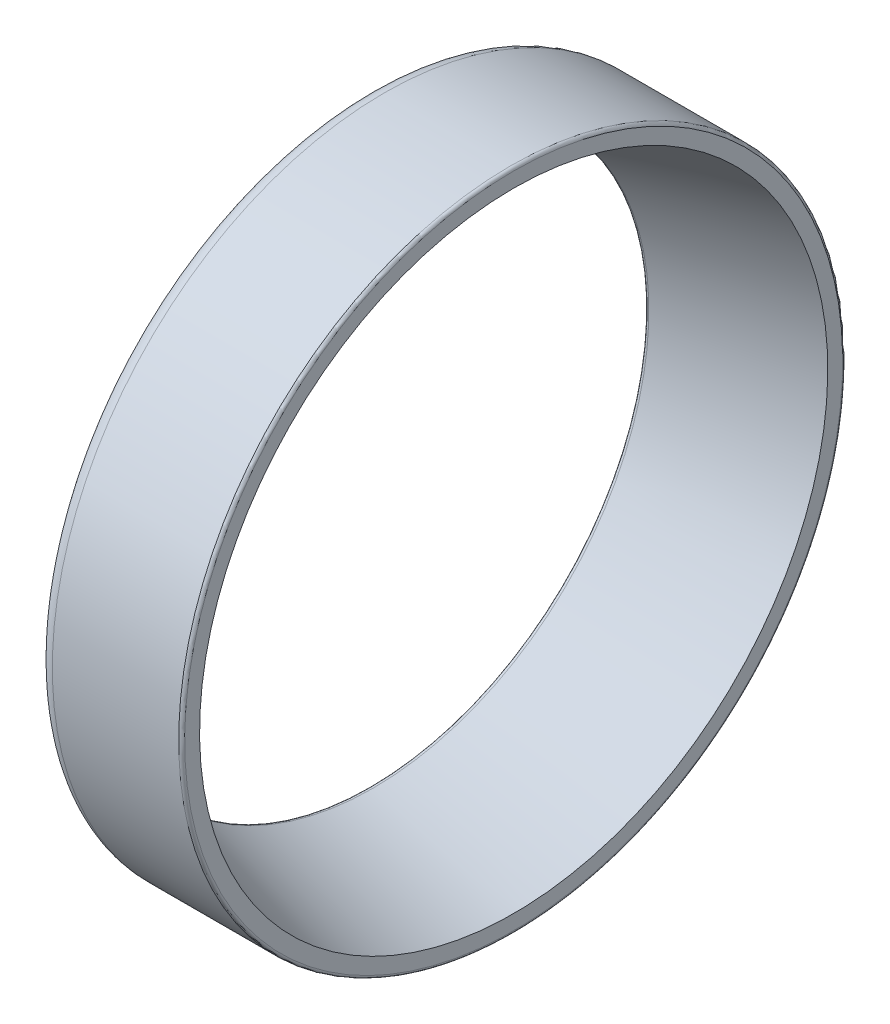
ISO-10303-21;
HEADER;
FILE_DESCRIPTION(('STEP AP214'),'2;1');
FILE_NAME('part.step','',(''),(''),'','','');
FILE_SCHEMA(('AUTOMOTIVE_DESIGN { 1 0 10303 214 1 1 1 1 }'));
ENDSEC;
DATA;
#1=APPLICATION_CONTEXT('core data for automotive mechanical design processes');
#2=APPLICATION_PROTOCOL_DEFINITION('international standard','automotive_design',2000,#1);
#3=PRODUCT_CONTEXT('',#1,'mechanical');
#4=PRODUCT('Part','Part','',(#3));
#5=PRODUCT_RELATED_PRODUCT_CATEGORY('part','',(#4));
#6=PRODUCT_DEFINITION_FORMATION('','',#4);
#7=PRODUCT_DEFINITION_CONTEXT('part definition',#1,'design');
#8=PRODUCT_DEFINITION('design','',#6,#7);
#9=PRODUCT_DEFINITION_SHAPE('','',#8);
#10=(LENGTH_UNIT() NAMED_UNIT(*) SI_UNIT(.MILLI.,.METRE.));
#11=(NAMED_UNIT(*) PLANE_ANGLE_UNIT() SI_UNIT($,.RADIAN.));
#12=(NAMED_UNIT(*) SI_UNIT($,.STERADIAN.) SOLID_ANGLE_UNIT());
#13=UNCERTAINTY_MEASURE_WITH_UNIT(LENGTH_MEASURE(1.E-05),#10,'distance_accuracy_value','');
#14=(GEOMETRIC_REPRESENTATION_CONTEXT(3) GLOBAL_UNCERTAINTY_ASSIGNED_CONTEXT((#13)) GLOBAL_UNIT_ASSIGNED_CONTEXT((#10,
#11,#12)) REPRESENTATION_CONTEXT('',''));
#15=CARTESIAN_POINT('',(0.,0.,0.));
#16=DIRECTION('',(0.,0.,1.));
#17=DIRECTION('',(1.,0.,0.));
#18=AXIS2_PLACEMENT_3D('',#15,#16,#17);
#19=CARTESIAN_POINT('',(0.66,0.,0.));
#20=DIRECTION('',(1.,0.,0.));
#21=DIRECTION('',(0.,0.,-1.));
#22=AXIS2_PLACEMENT_3D('',#19,#20,#21);
#23=TOROIDAL_SURFACE('',#22,61.2967629666689,0.66);
#24=CARTESIAN_POINT('',(0.833600601542264,0.,0.));
#25=DIRECTION('',(1.,0.,0.));
#26=DIRECTION('',(0.,1.,0.));
#27=AXIS2_PLACEMENT_3D('',#24,#25,#26);
#28=CIRCLE('',#27,60.6600033329418);
#29=CARTESIAN_POINT('',(0.833600601542264,60.6600033329418,0.));
#30=VERTEX_POINT('',#29);
#31=EDGE_CURVE('E11',#30,#30,#28,.T.);
#32=ORIENTED_EDGE('',*,*,#31,.T.);
#33=EDGE_LOOP('',(#32));
#34=FACE_BOUND('',#33,.T.);
#35=CARTESIAN_POINT('',(0.,0.,0.));
#36=DIRECTION('',(1.,0.,0.));
#37=DIRECTION('',(0.,1.,0.));
#38=AXIS2_PLACEMENT_3D('',#35,#36,#37);
#39=CIRCLE('',#38,61.2967629666689);
#40=CARTESIAN_POINT('',(0.,61.2967629666689,0.));
#41=VERTEX_POINT('',#40);
#42=EDGE_CURVE('E47',#41,#41,#39,.T.);
#43=ORIENTED_EDGE('',*,*,#42,.F.);
#44=EDGE_LOOP('',(#43));
#45=FACE_BOUND('',#44,.T.);
#46=ADVANCED_FACE('F17',(#34,#45),#23,.T.);
#47=CARTESIAN_POINT('',(16.2918003007712,0.,0.));
#48=DIRECTION('',(1.,0.,0.));
#49=DIRECTION('',(0.,1.,0.));
#50=AXIS2_PLACEMENT_3D('',#47,#48,#49);
#51=CONICAL_SURFACE('',#50,64.8743922866503,0.266162710929136);
#52=CARTESIAN_POINT('',(31.75,0.,0.));
#53=DIRECTION('',(1.,0.,0.));
#54=DIRECTION('',(0.,1.,0.));
#55=AXIS2_PLACEMENT_3D('',#52,#53,#54);
#56=CIRCLE('',#55,69.0887812403587);
#57=CARTESIAN_POINT('',(31.75,69.0887812403587,0.));
#58=VERTEX_POINT('',#57);
#59=EDGE_CURVE('E27',#58,#58,#56,.T.);
#60=ORIENTED_EDGE('',*,*,#59,.T.);
#61=EDGE_LOOP('',(#60));
#62=FACE_BOUND('',#61,.T.);
#63=ORIENTED_EDGE('',*,*,#31,.F.);
#64=EDGE_LOOP('',(#63));
#65=FACE_BOUND('',#64,.T.);
#66=ADVANCED_FACE('F81',(#62,#65),#51,.F.);
#67=CARTESIAN_POINT('',(31.75,70.7268906201794,0.));
#68=DIRECTION('',(1.,0.,0.));
#69=DIRECTION('',(0.,1.,0.));
#70=AXIS2_PLACEMENT_3D('',#67,#68,#69);
#71=PLANE('',#70);
#72=CARTESIAN_POINT('',(31.75,0.,0.));
#73=DIRECTION('',(1.,0.,0.));
#74=DIRECTION('',(0.,1.,0.));
#75=AXIS2_PLACEMENT_3D('',#72,#73,#74);
#76=CIRCLE('',#75,72.365);
#77=CARTESIAN_POINT('',(31.75,72.365,0.));
#78=VERTEX_POINT('',#77);
#79=EDGE_CURVE('E58',#78,#78,#76,.T.);
#80=ORIENTED_EDGE('',*,*,#79,.T.);
#81=EDGE_LOOP('',(#80));
#82=FACE_BOUND('',#81,.T.);
#83=ORIENTED_EDGE('',*,*,#59,.F.);
#84=EDGE_LOOP('',(#83));
#85=FACE_BOUND('',#84,.T.);
#86=ADVANCED_FACE('F19',(#82,#85),#71,.T.);
#87=CARTESIAN_POINT('',(31.09,0.,0.));
#88=DIRECTION('',(1.,0.,0.));
#89=DIRECTION('',(0.,0.,-1.));
#90=AXIS2_PLACEMENT_3D('',#87,#88,#89);
#91=TOROIDAL_SURFACE('',#90,72.365,0.66);
#92=CARTESIAN_POINT('',(31.09,0.,0.));
#93=DIRECTION('',(1.,0.,0.));
#94=DIRECTION('',(0.,1.,0.));
#95=AXIS2_PLACEMENT_3D('',#92,#93,#94);
#96=CIRCLE('',#95,73.025);
#97=CARTESIAN_POINT('',(31.09,73.025,0.));
#98=VERTEX_POINT('',#97);
#99=EDGE_CURVE('E53',#98,#98,#96,.T.);
#100=ORIENTED_EDGE('',*,*,#99,.T.);
#101=EDGE_LOOP('',(#100));
#102=FACE_BOUND('',#101,.T.);
#103=ORIENTED_EDGE('',*,*,#79,.F.);
#104=EDGE_LOOP('',(#103));
#105=FACE_BOUND('',#104,.T.);
#106=ADVANCED_FACE('F64',(#102,#105),#91,.T.);
#107=CARTESIAN_POINT('',(17.195,0.,0.));
#108=DIRECTION('',(-1.,0.,0.));
#109=DIRECTION('',(0.,1.,0.));
#110=AXIS2_PLACEMENT_3D('',#107,#108,#109);
#111=CYLINDRICAL_SURFACE('',#110,73.025);
#112=CARTESIAN_POINT('',(3.3,0.,0.));
#113=DIRECTION('',(1.,0.,0.));
#114=DIRECTION('',(0.,1.,0.));
#115=AXIS2_PLACEMENT_3D('',#112,#113,#114);
#116=CIRCLE('',#115,73.025);
#117=CARTESIAN_POINT('',(3.3,73.025,0.));
#118=VERTEX_POINT('',#117);
#119=EDGE_CURVE('E51',#118,#118,#116,.T.);
#120=ORIENTED_EDGE('',*,*,#119,.T.);
#121=EDGE_LOOP('',(#120));
#122=FACE_BOUND('',#121,.T.);
#123=ORIENTED_EDGE('',*,*,#99,.F.);
#124=EDGE_LOOP('',(#123));
#125=FACE_BOUND('',#124,.T.);
#126=ADVANCED_FACE('F67',(#122,#125),#111,.T.);
#127=CARTESIAN_POINT('',(3.3,0.,0.));
#128=DIRECTION('',(1.,0.,0.));
#129=DIRECTION('',(0.,0.,-1.));
#130=AXIS2_PLACEMENT_3D('',#127,#128,#129);
#131=TOROIDAL_SURFACE('',#130,69.725,3.3);
#132=CARTESIAN_POINT('',(0.,0.,0.));
#133=DIRECTION('',(1.,0.,0.));
#134=DIRECTION('',(0.,1.,0.));
#135=AXIS2_PLACEMENT_3D('',#132,#133,#134);
#136=CIRCLE('',#135,69.725);
#137=CARTESIAN_POINT('',(0.,69.725,0.));
#138=VERTEX_POINT('',#137);
#139=EDGE_CURVE('E21',#138,#138,#136,.T.);
#140=ORIENTED_EDGE('',*,*,#139,.T.);
#141=EDGE_LOOP('',(#140));
#142=FACE_BOUND('',#141,.T.);
#143=ORIENTED_EDGE('',*,*,#119,.F.);
#144=EDGE_LOOP('',(#143));
#145=FACE_BOUND('',#144,.T.);
#146=ADVANCED_FACE('F69',(#142,#145),#131,.T.);
#147=CARTESIAN_POINT('',(0.,65.5108814833344,0.));
#148=DIRECTION('',(-1.,0.,0.));
#149=DIRECTION('',(0.,-1.,0.));
#150=AXIS2_PLACEMENT_3D('',#147,#148,#149);
#151=PLANE('',#150);
#152=ORIENTED_EDGE('',*,*,#42,.T.);
#153=EDGE_LOOP('',(#152));
#154=FACE_BOUND('',#153,.T.);
#155=ORIENTED_EDGE('',*,*,#139,.F.);
#156=EDGE_LOOP('',(#155));
#157=FACE_BOUND('',#156,.T.);
#158=ADVANCED_FACE('F48',(#154,#157),#151,.T.);
#159=CLOSED_SHELL('',(#46,#66,#86,#106,#126,#146,#158));
#160=MANIFOLD_SOLID_BREP('B1',#159);
#161=ADVANCED_BREP_SHAPE_REPRESENTATION('',(#18,#160),#14);
#162=SHAPE_DEFINITION_REPRESENTATION(#9,#161);
ENDSEC;
END-ISO-10303-21;
